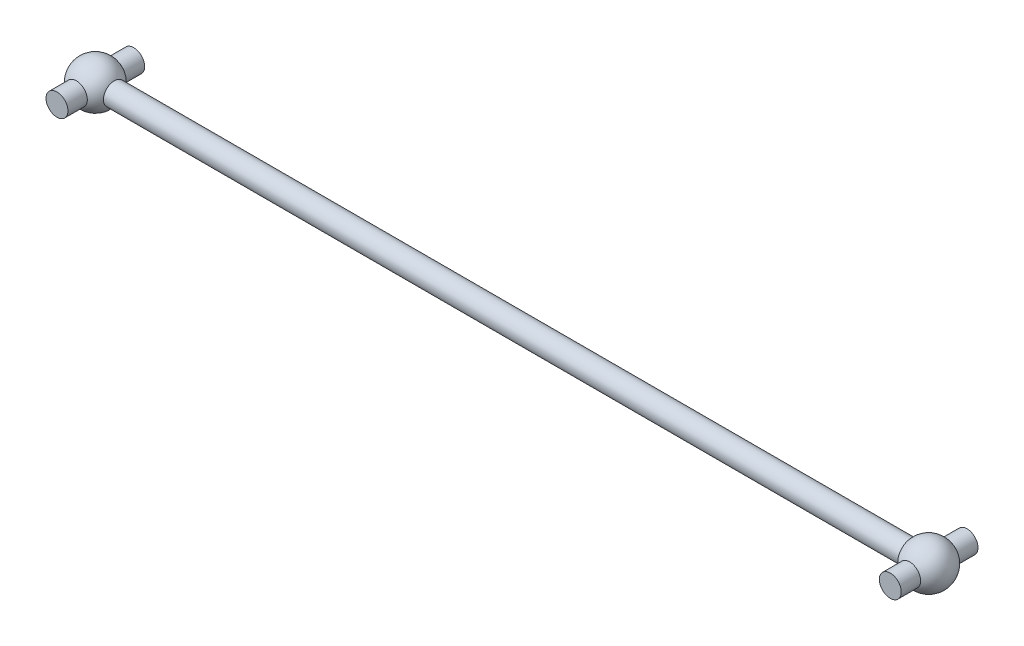
ISO-10303-21;
HEADER;
FILE_DESCRIPTION(('STEP AP214'),'2;1');
FILE_NAME('part.step','',(''),(''),'','','');
FILE_SCHEMA(('AUTOMOTIVE_DESIGN { 1 0 10303 214 1 1 1 1 }'));
ENDSEC;
DATA;
#1=APPLICATION_CONTEXT('core data for automotive mechanical design processes');
#2=APPLICATION_PROTOCOL_DEFINITION('international standard','automotive_design',2000,#1);
#3=PRODUCT_CONTEXT('',#1,'mechanical');
#4=PRODUCT('Part','Part','',(#3));
#5=PRODUCT_RELATED_PRODUCT_CATEGORY('part','',(#4));
#6=PRODUCT_DEFINITION_FORMATION('','',#4);
#7=PRODUCT_DEFINITION_CONTEXT('part definition',#1,'design');
#8=PRODUCT_DEFINITION('design','',#6,#7);
#9=PRODUCT_DEFINITION_SHAPE('','',#8);
#10=(LENGTH_UNIT() NAMED_UNIT(*) SI_UNIT(.MILLI.,.METRE.));
#11=(NAMED_UNIT(*) PLANE_ANGLE_UNIT() SI_UNIT($,.RADIAN.));
#12=(NAMED_UNIT(*) SI_UNIT($,.STERADIAN.) SOLID_ANGLE_UNIT());
#13=UNCERTAINTY_MEASURE_WITH_UNIT(LENGTH_MEASURE(1.E-05),#10,'distance_accuracy_value','');
#14=(GEOMETRIC_REPRESENTATION_CONTEXT(3) GLOBAL_UNCERTAINTY_ASSIGNED_CONTEXT((#13)) GLOBAL_UNIT_ASSIGNED_CONTEXT((#10,
#11,#12)) REPRESENTATION_CONTEXT('',''));
#15=CARTESIAN_POINT('',(0.,0.,0.));
#16=DIRECTION('',(0.,0.,1.));
#17=DIRECTION('',(1.,0.,0.));
#18=AXIS2_PLACEMENT_3D('',#15,#16,#17);
#19=CARTESIAN_POINT('',(0.,0.,0.));
#20=DIRECTION('',(1.,0.,0.));
#21=DIRECTION('',(0.,1.,0.));
#22=AXIS2_PLACEMENT_3D('',#19,#20,#21);
#23=SPHERICAL_SURFACE('',#22,3.175);
#24=CARTESIAN_POINT('',(0.,0.,2.74963065701559));
#25=DIRECTION('',(0.,0.,-1.));
#26=DIRECTION('',(-1.,0.,0.));
#27=AXIS2_PLACEMENT_3D('',#24,#25,#26);
#28=CIRCLE('',#27,1.5875);
#29=CARTESIAN_POINT('',(-1.5875,0.,2.74963065701559));
#30=VERTEX_POINT('',#29);
#31=EDGE_CURVE('E67',#30,#30,#28,.T.);
#32=ORIENTED_EDGE('',*,*,#31,.T.);
#33=EDGE_LOOP('',(#32));
#34=FACE_BOUND('',#33,.T.);
#35=CARTESIAN_POINT('',(2.7496306570156,0.,0.));
#36=DIRECTION('',(1.,0.,0.));
#37=DIRECTION('',(0.,0.,-1.));
#38=AXIS2_PLACEMENT_3D('',#35,#36,#37);
#39=CIRCLE('',#38,1.5875);
#40=CARTESIAN_POINT('',(2.7496306570156,0.,-1.5875));
#41=VERTEX_POINT('',#40);
#42=EDGE_CURVE('E50',#41,#41,#39,.T.);
#43=ORIENTED_EDGE('',*,*,#42,.F.);
#44=EDGE_LOOP('',(#43));
#45=FACE_BOUND('',#44,.T.);
#46=CARTESIAN_POINT('',(0.,0.,-2.74963065701559));
#47=DIRECTION('',(0.,0.,1.));
#48=DIRECTION('',(1.,0.,0.));
#49=AXIS2_PLACEMENT_3D('',#46,#47,#48);
#50=CIRCLE('',#49,1.5875);
#51=CARTESIAN_POINT('',(1.5875,0.,-2.74963065701559));
#52=VERTEX_POINT('',#51);
#53=EDGE_CURVE('E45',#52,#52,#50,.T.);
#54=ORIENTED_EDGE('',*,*,#53,.T.);
#55=EDGE_LOOP('',(#54));
#56=FACE_BOUND('',#55,.T.);
#57=ADVANCED_FACE('F42',(#34,#45,#56),#23,.T.);
#58=CARTESIAN_POINT('',(120.65,0.,0.));
#59=DIRECTION('',(1.,0.,0.));
#60=DIRECTION('',(0.,-1.,0.));
#61=AXIS2_PLACEMENT_3D('',#58,#59,#60);
#62=SPHERICAL_SURFACE('',#61,3.175);
#63=CARTESIAN_POINT('',(120.65,0.,2.74963065701559));
#64=DIRECTION('',(0.,0.,-1.));
#65=DIRECTION('',(-1.,0.,0.));
#66=AXIS2_PLACEMENT_3D('',#63,#64,#65);
#67=CIRCLE('',#66,1.5875);
#68=CARTESIAN_POINT('',(119.0625,0.,2.74963065701559));
#69=VERTEX_POINT('',#68);
#70=EDGE_CURVE('E62',#69,#69,#67,.T.);
#71=ORIENTED_EDGE('',*,*,#70,.T.);
#72=EDGE_LOOP('',(#71));
#73=FACE_BOUND('',#72,.T.);
#74=CARTESIAN_POINT('',(117.900369342984,0.,0.));
#75=DIRECTION('',(1.,0.,0.));
#76=DIRECTION('',(0.,0.,-1.));
#77=AXIS2_PLACEMENT_3D('',#74,#75,#76);
#78=CIRCLE('',#77,1.5875);
#79=CARTESIAN_POINT('',(117.900369342984,0.,-1.5875));
#80=VERTEX_POINT('',#79);
#81=EDGE_CURVE('E10',#80,#80,#78,.T.);
#82=ORIENTED_EDGE('',*,*,#81,.T.);
#83=EDGE_LOOP('',(#82));
#84=FACE_BOUND('',#83,.T.);
#85=CARTESIAN_POINT('',(120.65,0.,-2.74963065701559));
#86=DIRECTION('',(0.,0.,1.));
#87=DIRECTION('',(1.,0.,0.));
#88=AXIS2_PLACEMENT_3D('',#85,#86,#87);
#89=CIRCLE('',#88,1.5875);
#90=CARTESIAN_POINT('',(122.2375,0.,-2.74963065701559));
#91=VERTEX_POINT('',#90);
#92=EDGE_CURVE('E58',#91,#91,#89,.T.);
#93=ORIENTED_EDGE('',*,*,#92,.T.);
#94=EDGE_LOOP('',(#93));
#95=FACE_BOUND('',#94,.T.);
#96=ADVANCED_FACE('F109',(#73,#84,#95),#62,.T.);
#97=CARTESIAN_POINT('',(123.825,0.,0.));
#98=DIRECTION('',(1.,0.,0.));
#99=DIRECTION('',(0.,0.,-1.));
#100=AXIS2_PLACEMENT_3D('',#97,#98,#99);
#101=CYLINDRICAL_SURFACE('',#100,1.5875);
#102=ORIENTED_EDGE('',*,*,#81,.F.);
#103=EDGE_LOOP('',(#102));
#104=FACE_BOUND('',#103,.T.);
#105=ORIENTED_EDGE('',*,*,#42,.T.);
#106=EDGE_LOOP('',(#105));
#107=FACE_BOUND('',#106,.T.);
#108=ADVANCED_FACE('F115',(#104,#107),#101,.T.);
#109=CARTESIAN_POINT('',(0.,0.,5.55625));
#110=DIRECTION('',(0.,0.,1.));
#111=DIRECTION('',(1.,0.,0.));
#112=AXIS2_PLACEMENT_3D('',#109,#110,#111);
#113=PLANE('',#112);
#114=CARTESIAN_POINT('',(120.65,0.,5.55625));
#115=DIRECTION('',(0.,0.,1.));
#116=DIRECTION('',(1.,0.,0.));
#117=AXIS2_PLACEMENT_3D('',#114,#115,#116);
#118=CIRCLE('',#117,1.5875);
#119=CARTESIAN_POINT('',(122.2375,0.,5.55625));
#120=VERTEX_POINT('',#119);
#121=EDGE_CURVE('E65',#120,#120,#118,.T.);
#122=ORIENTED_EDGE('',*,*,#121,.T.);
#123=EDGE_LOOP('',(#122));
#124=FACE_BOUND('',#123,.T.);
#125=ADVANCED_FACE('F135',(#124),#113,.T.);
#126=CARTESIAN_POINT('',(120.65,0.,5.55625));
#127=DIRECTION('',(0.,0.,-1.));
#128=DIRECTION('',(-1.,0.,0.));
#129=AXIS2_PLACEMENT_3D('',#126,#127,#128);
#130=CYLINDRICAL_SURFACE('',#129,1.5875);
#131=ORIENTED_EDGE('',*,*,#70,.F.);
#132=EDGE_LOOP('',(#131));
#133=FACE_BOUND('',#132,.T.);
#134=ORIENTED_EDGE('',*,*,#121,.F.);
#135=EDGE_LOOP('',(#134));
#136=FACE_BOUND('',#135,.T.);
#137=ADVANCED_FACE('F104',(#133,#136),#130,.T.);
#138=ORIENTED_EDGE('',*,*,#92,.F.);
#139=EDGE_LOOP('',(#138));
#140=FACE_BOUND('',#139,.T.);
#141=CARTESIAN_POINT('',(120.65,0.,-5.55625));
#142=DIRECTION('',(0.,0.,1.));
#143=DIRECTION('',(1.,0.,0.));
#144=AXIS2_PLACEMENT_3D('',#141,#142,#143);
#145=CIRCLE('',#144,1.5875);
#146=CARTESIAN_POINT('',(122.2375,0.,-5.55625));
#147=VERTEX_POINT('',#146);
#148=EDGE_CURVE('E76',#147,#147,#145,.T.);
#149=ORIENTED_EDGE('',*,*,#148,.T.);
#150=EDGE_LOOP('',(#149));
#151=FACE_BOUND('',#150,.T.);
#152=ADVANCED_FACE('F92',(#140,#151),#130,.T.);
#153=CARTESIAN_POINT('',(0.,0.,-5.55625));
#154=DIRECTION('',(0.,0.,1.));
#155=DIRECTION('',(1.,0.,0.));
#156=AXIS2_PLACEMENT_3D('',#153,#154,#155);
#157=PLANE('',#156);
#158=ORIENTED_EDGE('',*,*,#148,.F.);
#159=EDGE_LOOP('',(#158));
#160=FACE_BOUND('',#159,.T.);
#161=ADVANCED_FACE('F94',(#160),#157,.F.);
#162=CARTESIAN_POINT('',(0.,0.,5.55625));
#163=DIRECTION('',(0.,0.,1.));
#164=DIRECTION('',(1.,0.,0.));
#165=AXIS2_PLACEMENT_3D('',#162,#163,#164);
#166=PLANE('',#165);
#167=CARTESIAN_POINT('',(0.,0.,5.55625));
#168=DIRECTION('',(0.,0.,1.));
#169=DIRECTION('',(1.,0.,0.));
#170=AXIS2_PLACEMENT_3D('',#167,#168,#169);
#171=CIRCLE('',#170,1.5875);
#172=CARTESIAN_POINT('',(1.5875,0.,5.55625));
#173=VERTEX_POINT('',#172);
#174=EDGE_CURVE('E70',#173,#173,#171,.T.);
#175=ORIENTED_EDGE('',*,*,#174,.T.);
#176=EDGE_LOOP('',(#175));
#177=FACE_BOUND('',#176,.T.);
#178=ADVANCED_FACE('F96',(#177),#166,.T.);
#179=CARTESIAN_POINT('',(0.,0.,5.55625));
#180=DIRECTION('',(0.,0.,-1.));
#181=DIRECTION('',(-1.,0.,0.));
#182=AXIS2_PLACEMENT_3D('',#179,#180,#181);
#183=CYLINDRICAL_SURFACE('',#182,1.5875);
#184=ORIENTED_EDGE('',*,*,#31,.F.);
#185=EDGE_LOOP('',(#184));
#186=FACE_BOUND('',#185,.T.);
#187=ORIENTED_EDGE('',*,*,#174,.F.);
#188=EDGE_LOOP('',(#187));
#189=FACE_BOUND('',#188,.T.);
#190=ADVANCED_FACE('F102',(#186,#189),#183,.T.);
#191=ORIENTED_EDGE('',*,*,#53,.F.);
#192=EDGE_LOOP('',(#191));
#193=FACE_BOUND('',#192,.T.);
#194=CARTESIAN_POINT('',(0.,0.,-5.55625));
#195=DIRECTION('',(0.,0.,1.));
#196=DIRECTION('',(1.,0.,0.));
#197=AXIS2_PLACEMENT_3D('',#194,#195,#196);
#198=CIRCLE('',#197,1.5875);
#199=CARTESIAN_POINT('',(1.5875,0.,-5.55625));
#200=VERTEX_POINT('',#199);
#201=EDGE_CURVE('E78',#200,#200,#198,.T.);
#202=ORIENTED_EDGE('',*,*,#201,.T.);
#203=EDGE_LOOP('',(#202));
#204=FACE_BOUND('',#203,.T.);
#205=ADVANCED_FACE('F122',(#193,#204),#183,.T.);
#206=CARTESIAN_POINT('',(0.,0.,-5.55625));
#207=DIRECTION('',(0.,0.,1.));
#208=DIRECTION('',(1.,0.,0.));
#209=AXIS2_PLACEMENT_3D('',#206,#207,#208);
#210=PLANE('',#209);
#211=ORIENTED_EDGE('',*,*,#201,.F.);
#212=EDGE_LOOP('',(#211));
#213=FACE_BOUND('',#212,.T.);
#214=ADVANCED_FACE('F125',(#213),#210,.F.);
#215=CLOSED_SHELL('',(#57,#96,#108,#125,#137,#152,#161,#178,#190,#205,#214));
#216=MANIFOLD_SOLID_BREP('B2',#215);
#217=ADVANCED_BREP_SHAPE_REPRESENTATION('',(#18,#216),#14);
#218=SHAPE_DEFINITION_REPRESENTATION(#9,#217);
ENDSEC;
END-ISO-10303-21;
